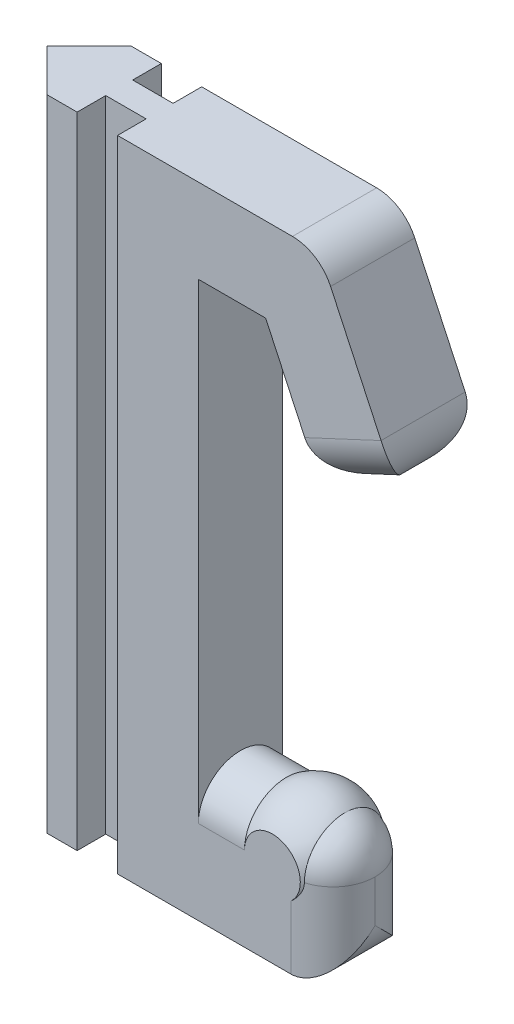
ISO-10303-21;
HEADER;
FILE_DESCRIPTION(('STEP AP214'),'2;1');
FILE_NAME('part.step','',(''),(''),'','','');
FILE_SCHEMA(('AUTOMOTIVE_DESIGN { 1 0 10303 214 1 1 1 1 }'));
ENDSEC;
DATA;
#1=APPLICATION_CONTEXT('core data for automotive mechanical design processes');
#2=APPLICATION_PROTOCOL_DEFINITION('international standard','automotive_design',2000,#1);
#3=PRODUCT_CONTEXT('',#1,'mechanical');
#4=PRODUCT('Part','Part','',(#3));
#5=PRODUCT_RELATED_PRODUCT_CATEGORY('part','',(#4));
#6=PRODUCT_DEFINITION_FORMATION('','',#4);
#7=PRODUCT_DEFINITION_CONTEXT('part definition',#1,'design');
#8=PRODUCT_DEFINITION('design','',#6,#7);
#9=PRODUCT_DEFINITION_SHAPE('','',#8);
#10=(LENGTH_UNIT() NAMED_UNIT(*) SI_UNIT(.MILLI.,.METRE.));
#11=(NAMED_UNIT(*) PLANE_ANGLE_UNIT() SI_UNIT($,.RADIAN.));
#12=(NAMED_UNIT(*) SI_UNIT($,.STERADIAN.) SOLID_ANGLE_UNIT());
#13=UNCERTAINTY_MEASURE_WITH_UNIT(LENGTH_MEASURE(1.E-05),#10,'distance_accuracy_value','');
#14=(GEOMETRIC_REPRESENTATION_CONTEXT(3) GLOBAL_UNCERTAINTY_ASSIGNED_CONTEXT((#13)) GLOBAL_UNIT_ASSIGNED_CONTEXT((#10,
#11,#12)) REPRESENTATION_CONTEXT('',''));
#15=CARTESIAN_POINT('',(0.,0.,0.));
#16=DIRECTION('',(0.,0.,1.));
#17=DIRECTION('',(1.,0.,0.));
#18=AXIS2_PLACEMENT_3D('',#15,#16,#17);
#19=CARTESIAN_POINT('',(13.5901699437495,0.,2.5));
#20=DIRECTION('',(-1.,0.,0.));
#21=DIRECTION('',(0.,0.,1.));
#22=AXIS2_PLACEMENT_3D('',#19,#20,#21);
#23=CYLINDRICAL_SURFACE('',#22,2.5);
#24=CARTESIAN_POINT('',(2.7416876048223,0.,2.5));
#25=DIRECTION('',(1.,0.,0.));
#26=DIRECTION('',(0.,0.,-1.));
#27=AXIS2_PLACEMENT_3D('',#24,#25,#26);
#28=CIRCLE('',#27,2.5);
#29=CARTESIAN_POINT('',(2.7416876048223,0.,0.));
#30=VERTEX_POINT('',#29);
#31=CARTESIAN_POINT('',(2.7416876048223,0.,5.));
#32=VERTEX_POINT('',#31);
#33=EDGE_CURVE('E319',#30,#32,#28,.T.);
#34=ORIENTED_EDGE('',*,*,#33,.F.);
#35=DIRECTION('',(-1.,0.,0.));
#36=VECTOR('',#35,1.);
#37=CARTESIAN_POINT('',(0.,0.,0.));
#38=LINE('',#37,#36);
#39=CARTESIAN_POINT('',(0.,0.,0.));
#40=VERTEX_POINT('',#39);
#41=EDGE_CURVE('E377',#30,#40,#38,.T.);
#42=ORIENTED_EDGE('',*,*,#41,.T.);
#43=CARTESIAN_POINT('',(0.,0.,2.5));
#44=DIRECTION('',(1.,0.,0.));
#45=DIRECTION('',(0.,0.,-1.));
#46=AXIS2_PLACEMENT_3D('',#43,#44,#45);
#47=CIRCLE('',#46,2.5);
#48=CARTESIAN_POINT('',(0.,0.,5.));
#49=VERTEX_POINT('',#48);
#50=EDGE_CURVE('E462',#40,#49,#47,.T.);
#51=ORIENTED_EDGE('',*,*,#50,.T.);
#52=DIRECTION('',(-1.,0.,0.));
#53=VECTOR('',#52,1.);
#54=CARTESIAN_POINT('',(0.,0.,5.));
#55=LINE('',#54,#53);
#56=EDGE_CURVE('E379',#32,#49,#55,.T.);
#57=ORIENTED_EDGE('',*,*,#56,.F.);
#58=EDGE_LOOP('',(#34,#42,#51,#57));
#59=FACE_BOUND('',#58,.T.);
#60=ADVANCED_FACE('F38',(#59),#23,.T.);
#61=CARTESIAN_POINT('',(5.5,0.,2.5));
#62=DIRECTION('',(0.,-1.,0.));
#63=DIRECTION('',(0.,0.,-1.));
#64=AXIS2_PLACEMENT_3D('',#61,#62,#63);
#65=CYLINDRICAL_SURFACE('',#64,2.5);
#66=DIRECTION('',(0.,1.,0.));
#67=VECTOR('',#66,1.);
#68=CARTESIAN_POINT('',(5.5,-5.,0.));
#69=LINE('',#68,#67);
#70=CARTESIAN_POINT('',(5.5,-1.24096736459909,0.));
#71=VERTEX_POINT('',#70);
#72=CARTESIAN_POINT('',(5.5,-5.,0.));
#73=VERTEX_POINT('',#72);
#74=EDGE_CURVE('E470',#71,#73,#69,.F.);
#75=ORIENTED_EDGE('',*,*,#74,.F.);
#76=CARTESIAN_POINT('',(5.4998,-1.24114463299005,8.00000016902827E-09));
#77=CARTESIAN_POINT('',(5.5363929673262,-1.2087029649529,-9.26164938594418E-06));
#78=CARTESIAN_POINT('',(5.57236876038989,-1.17555626849877,0.000797701220164483));
#79=CARTESIAN_POINT('',(5.6428030561148,-1.10769667819631,0.00383433659862335));
#80=CARTESIAN_POINT('',(5.67726031215857,-1.07298254322828,0.00606515556717435));
#81=CARTESIAN_POINT('',(5.74519128912905,-1.00095424317269,0.0118132669352874));
#82=CARTESIAN_POINT('',(5.77861573042543,-0.963595826296858,0.0153626740978221));
#83=CARTESIAN_POINT('',(5.84305795009588,-0.886981329738945,0.0234356736079336));
#84=CARTESIAN_POINT('',(5.8740762229525,-0.847725642663384,0.0279590650703916));
#85=CARTESIAN_POINT('',(5.96325201148396,-0.726269508254624,0.0425618511089545));
#86=CARTESIAN_POINT('',(6.01705538420124,-0.640865596374252,0.0536260746175861));
#87=CARTESIAN_POINT('',(6.10655009460944,-0.461922147892547,0.0742583939748457));
#88=CARTESIAN_POINT('',(6.14249859084772,-0.368522297372846,0.0838462716282923));
#89=CARTESIAN_POINT('',(6.17730370336194,-0.227795718404401,0.0934686773099394));
#90=CARTESIAN_POINT('',(6.18570287472368,-0.182960244601201,0.095864159554696));
#91=CARTESIAN_POINT('',(6.19710907659667,-0.0920455434275465,0.0991560697495526));
#92=CARTESIAN_POINT('',(6.20005395659277,-0.0459579806521384,0.100035211650277));
#93=CARTESIAN_POINT('',(6.19999998181818,0.000200000000000708,0.0999999946969699));
#94=B_SPLINE_CURVE_WITH_KNOTS('',3,(#76,#77,#78,#79,#80,#81,#82,#83,#84,#85,#86,#87,#88,#89,#90,
#91,#92,#93),.UNSPECIFIED.,.F.,.F.,(4,2,2,2,2,2,2,2,4),(0.,0.146701218214616,0.29352070649968,
0.444179394748281,0.594807039223552,0.898088830284033,1.196865790681,1.3335683412279,
1.4718192264105),.UNSPECIFIED.);
#95=CARTESIAN_POINT('',(6.2,0.,0.100000000000001));
#96=VERTEX_POINT('',#95);
#97=EDGE_CURVE('E310',#71,#96,#94,.T.);
#98=ORIENTED_EDGE('',*,*,#97,.T.);
#99=CARTESIAN_POINT('',(5.5,0.,2.5));
#100=DIRECTION('',(0.,1.,0.));
#101=DIRECTION('',(0.,0.,1.));
#102=AXIS2_PLACEMENT_3D('',#99,#100,#101);
#103=CIRCLE('',#102,2.5);
#104=CARTESIAN_POINT('',(8.,0.,2.5));
#105=VERTEX_POINT('',#104);
#106=EDGE_CURVE('E486',#105,#96,#103,.T.);
#107=ORIENTED_EDGE('',*,*,#106,.F.);
#108=DIRECTION('',(0.,1.,0.));
#109=VECTOR('',#108,1.);
#110=CARTESIAN_POINT('',(8.,0.,2.5));
#111=LINE('',#110,#109);
#112=CARTESIAN_POINT('',(8.,-2.5,2.5));
#113=VERTEX_POINT('',#112);
#114=EDGE_CURVE('E483',#113,#105,#111,.T.);
#115=ORIENTED_EDGE('',*,*,#114,.F.);
#116=CARTESIAN_POINT('',(5.5,-2.5,2.5));
#117=DIRECTION('',(0.,0.707106781186547,-0.707106781186547));
#118=DIRECTION('',(0.,-0.707106781186547,-0.707106781186547));
#119=AXIS2_PLACEMENT_3D('',#116,#117,#118);
#120=ELLIPSE('',#119,3.53553390593274,2.5);
#121=EDGE_CURVE('E344',#73,#113,#120,.F.);
#122=ORIENTED_EDGE('',*,*,#121,.F.);
#123=EDGE_LOOP('',(#75,#98,#107,#115,#122));
#124=FACE_BOUND('',#123,.T.);
#125=ADVANCED_FACE('F40',(#124),#65,.T.);
#126=CARTESIAN_POINT('',(5.5,0.,2.5));
#127=DIRECTION('',(-1.,0.,0.));
#128=DIRECTION('',(0.,0.,1.));
#129=AXIS2_PLACEMENT_3D('',#126,#127,#128);
#130=SPHERICAL_SURFACE('',#129,2.5);
#131=ORIENTED_EDGE('',*,*,#106,.T.);
#132=CARTESIAN_POINT('',(6.2,0.,2.5));
#133=DIRECTION('',(-1.,0.,0.));
#134=DIRECTION('',(0.,0.,1.));
#135=AXIS2_PLACEMENT_3D('',#132,#133,#134);
#136=CIRCLE('',#135,2.4);
#137=CARTESIAN_POINT('',(6.2,0.,4.9));
#138=VERTEX_POINT('',#137);
#139=EDGE_CURVE('E286',#96,#138,#136,.F.);
#140=ORIENTED_EDGE('',*,*,#139,.T.);
#141=CARTESIAN_POINT('',(5.5,0.,2.5));
#142=DIRECTION('',(0.,-1.,0.));
#143=DIRECTION('',(0.,0.,-1.));
#144=AXIS2_PLACEMENT_3D('',#141,#142,#143);
#145=CIRCLE('',#144,2.5);
#146=EDGE_CURVE('E382',#105,#138,#145,.T.);
#147=ORIENTED_EDGE('',*,*,#146,.F.);
#148=EDGE_LOOP('',(#131,#140,#147));
#149=FACE_BOUND('',#148,.T.);
#150=ADVANCED_FACE('F352',(#149),#130,.T.);
#151=CARTESIAN_POINT('',(5.5,0.,2.5));
#152=DIRECTION('',(0.,1.,0.));
#153=DIRECTION('',(0.,0.,1.));
#154=AXIS2_PLACEMENT_3D('',#151,#152,#153);
#155=CYLINDRICAL_SURFACE('',#154,2.5);
#156=ORIENTED_EDGE('',*,*,#146,.T.);
#157=CARTESIAN_POINT('',(6.19999998181818,0.0002,4.90000000530303));
#158=CARTESIAN_POINT('',(6.20002060593483,-0.0340215820751625,4.8999881731683));
#159=CARTESIAN_POINT('',(6.1984143593459,-0.0682209096207422,4.90046286433432));
#160=CARTESIAN_POINT('',(6.19208379810463,-0.136249463080852,4.90229830533756));
#161=CARTESIAN_POINT('',(6.18736474729119,-0.170079215952131,4.90365755930238));
#162=CARTESIAN_POINT('',(6.1689482938362,-0.269536910764676,4.90887369332737));
#163=CARTESIAN_POINT('',(6.15098131886339,-0.334336983187606,4.91387497360715));
#164=CARTESIAN_POINT('',(6.09808868579219,-0.480851170246759,4.92759913373652));
#165=CARTESIAN_POINT('',(6.05953499991633,-0.561148858343043,4.9370045157109));
#166=CARTESIAN_POINT('',(5.97007827325949,-0.715449277029459,4.95583685420229));
#167=CARTESIAN_POINT('',(5.91904380010561,-0.789372868652353,4.96526290588241));
#168=CARTESIAN_POINT('',(5.80922506209963,-0.929818254648964,4.98141526656959));
#169=CARTESIAN_POINT('',(5.75055545651682,-0.996426935956447,4.98817650123594));
#170=CARTESIAN_POINT('',(5.65870838300495,-1.09170672728009,4.99514321976577));
#171=CARTESIAN_POINT('',(5.62774086496115,-1.12244386881611,4.99693401300135));
#172=CARTESIAN_POINT('',(5.56461568283012,-1.1826876244331,4.99936451304459));
#173=CARTESIAN_POINT('',(5.5324586096933,-1.21219483443042,5.00000478377816));
#174=CARTESIAN_POINT('',(5.4998,-1.24114463299005,4.999999992));
#175=B_SPLINE_CURVE_WITH_KNOTS('',3,(#157,#158,#159,#160,#161,#162,#163,#164,#165,#166,#167,
#168,#169,#170,#171,#172,#173,#174),.UNSPECIFIED.,.F.,.F.,(4,2,2,2,2,2,2,2,4),(0.,
0.102583403755103,0.204993779301411,0.406260766109181,0.673486519863846,0.943657669752398,
1.21015973265302,1.34112701736425,1.47203009124063),.UNSPECIFIED.);
#176=CARTESIAN_POINT('',(5.5,-1.24096736459909,5.));
#177=VERTEX_POINT('',#176);
#178=EDGE_CURVE('E334',#138,#177,#175,.T.);
#179=ORIENTED_EDGE('',*,*,#178,.T.);
#180=DIRECTION('',(0.,1.,0.));
#181=VECTOR('',#180,1.);
#182=CARTESIAN_POINT('',(5.5,0.,5.));
#183=LINE('',#182,#181);
#184=CARTESIAN_POINT('',(5.5,-5.,5.));
#185=VERTEX_POINT('',#184);
#186=EDGE_CURVE('E456',#185,#177,#183,.T.);
#187=ORIENTED_EDGE('',*,*,#186,.F.);
#188=CARTESIAN_POINT('',(5.5,-2.5,2.5));
#189=DIRECTION('',(0.,-0.707106781186547,-0.707106781186547));
#190=DIRECTION('',(0.,0.707106781186547,-0.707106781186547));
#191=AXIS2_PLACEMENT_3D('',#188,#189,#190);
#192=ELLIPSE('',#191,3.53553390593274,2.5);
#193=EDGE_CURVE('E479',#185,#113,#192,.F.);
#194=ORIENTED_EDGE('',*,*,#193,.T.);
#195=ORIENTED_EDGE('',*,*,#114,.T.);
#196=EDGE_LOOP('',(#156,#179,#187,#194,#195));
#197=FACE_BOUND('',#196,.T.);
#198=ADVANCED_FACE('F346',(#197),#155,.T.);
#199=CARTESIAN_POINT('',(0.,0.,5.));
#200=DIRECTION('',(-1.,0.,0.));
#201=DIRECTION('',(0.,0.,1.));
#202=AXIS2_PLACEMENT_3D('',#199,#200,#201);
#203=PLANE('',#202);
#204=ORIENTED_EDGE('',*,*,#50,.F.);
#205=DIRECTION('',(0.,1.,0.));
#206=VECTOR('',#205,1.);
#207=CARTESIAN_POINT('',(0.,0.,0.));
#208=LINE('',#207,#206);
#209=CARTESIAN_POINT('',(0.,28.,0.));
#210=VERTEX_POINT('',#209);
#211=EDGE_CURVE('E389',#40,#210,#208,.T.);
#212=ORIENTED_EDGE('',*,*,#211,.T.);
#213=DIRECTION('',(0.,0.,-1.));
#214=VECTOR('',#213,1.);
#215=CARTESIAN_POINT('',(0.,28.,5.));
#216=LINE('',#215,#214);
#217=CARTESIAN_POINT('',(0.,28.,5.));
#218=VERTEX_POINT('',#217);
#219=EDGE_CURVE('E426',#218,#210,#216,.T.);
#220=ORIENTED_EDGE('',*,*,#219,.F.);
#221=DIRECTION('',(0.,1.,0.));
#222=VECTOR('',#221,1.);
#223=CARTESIAN_POINT('',(0.,0.,5.));
#224=LINE('',#223,#222);
#225=EDGE_CURVE('E498',#49,#218,#224,.T.);
#226=ORIENTED_EDGE('',*,*,#225,.F.);
#227=EDGE_LOOP('',(#204,#212,#220,#226));
#228=FACE_BOUND('',#227,.T.);
#229=ADVANCED_FACE('F351',(#228),#203,.F.);
#230=CARTESIAN_POINT('',(0.,28.,5.));
#231=DIRECTION('',(0.,1.,0.));
#232=DIRECTION('',(0.,0.,1.));
#233=AXIS2_PLACEMENT_3D('',#230,#231,#232);
#234=PLANE('',#233);
#235=DIRECTION('',(1.,0.,0.));
#236=VECTOR('',#235,1.);
#237=CARTESIAN_POINT('',(0.,28.,0.));
#238=LINE('',#237,#236);
#239=CARTESIAN_POINT('',(4.,28.,0.));
#240=VERTEX_POINT('',#239);
#241=EDGE_CURVE('E396',#210,#240,#238,.T.);
#242=ORIENTED_EDGE('',*,*,#241,.T.);
#243=DIRECTION('',(0.,0.,-1.));
#244=VECTOR('',#243,1.);
#245=CARTESIAN_POINT('',(4.,28.,5.));
#246=LINE('',#245,#244);
#247=CARTESIAN_POINT('',(4.,28.,5.));
#248=VERTEX_POINT('',#247);
#249=EDGE_CURVE('E422',#248,#240,#246,.T.);
#250=ORIENTED_EDGE('',*,*,#249,.F.);
#251=DIRECTION('',(1.,0.,0.));
#252=VECTOR('',#251,1.);
#253=CARTESIAN_POINT('',(0.,28.,5.));
#254=LINE('',#253,#252);
#255=EDGE_CURVE('E501',#218,#248,#254,.T.);
#256=ORIENTED_EDGE('',*,*,#255,.F.);
#257=ORIENTED_EDGE('',*,*,#219,.T.);
#258=EDGE_LOOP('',(#242,#250,#256,#257));
#259=FACE_BOUND('',#258,.T.);
#260=ADVANCED_FACE('F529',(#259),#234,.F.);
#261=CARTESIAN_POINT('',(4.,28.,5.));
#262=DIRECTION('',(0.906307787036651,0.422618261740697,0.));
#263=DIRECTION('',(-0.422618261740697,0.906307787036651,0.));
#264=AXIS2_PLACEMENT_3D('',#261,#262,#263);
#265=PLANE('',#264);
#266=DIRECTION('',(0.422618261740697,-0.906307787036651,0.));
#267=VECTOR('',#266,1.);
#268=CARTESIAN_POINT('',(4.,28.,0.));
#269=LINE('',#268,#267);
#270=CARTESIAN_POINT('',(6.32440043957384,23.0153071712984,0.));
#271=VERTEX_POINT('',#270);
#272=EDGE_CURVE('E407',#240,#271,#269,.T.);
#273=ORIENTED_EDGE('',*,*,#272,.T.);
#274=DIRECTION('',(0.,0.,-1.));
#275=VECTOR('',#274,1.);
#276=CARTESIAN_POINT('',(6.32440043957383,23.0153071712984,5.));
#277=LINE('',#276,#275);
#278=CARTESIAN_POINT('',(6.32440043957384,23.0153071712984,5.));
#279=VERTEX_POINT('',#278);
#280=EDGE_CURVE('E430',#271,#279,#277,.F.);
#281=ORIENTED_EDGE('',*,*,#280,.T.);
#282=DIRECTION('',(0.422618261740697,-0.906307787036651,0.));
#283=VECTOR('',#282,1.);
#284=CARTESIAN_POINT('',(4.,28.,5.));
#285=LINE('',#284,#283);
#286=EDGE_CURVE('E504',#248,#279,#285,.T.);
#287=ORIENTED_EDGE('',*,*,#286,.F.);
#288=ORIENTED_EDGE('',*,*,#249,.T.);
#289=EDGE_LOOP('',(#273,#281,#287,#288));
#290=FACE_BOUND('',#289,.T.);
#291=ADVANCED_FACE('F534',(#290),#265,.F.);
#292=CARTESIAN_POINT('',(11.9124850291088,22.8626290124103,5.));
#293=DIRECTION('',(-0.906307787036651,-0.422618261740697,0.));
#294=DIRECTION('',(0.422618261740697,-0.906307787036651,0.));
#295=AXIS2_PLACEMENT_3D('',#292,#293,#294);
#296=PLANE('',#295);
#297=DIRECTION('',(-0.422618261740697,0.906307787036651,0.));
#298=VECTOR('',#297,1.);
#299=CARTESIAN_POINT('',(11.9124850291088,22.8626290124103,5.));
#300=LINE('',#299,#298);
#301=CARTESIAN_POINT('',(10.8559393747571,25.1283984800019,5.));
#302=VERTEX_POINT('',#301);
#303=CARTESIAN_POINT('',(7.85844511961037,31.5565456543517,5.));
#304=VERTEX_POINT('',#303);
#305=EDGE_CURVE('E508',#302,#304,#300,.T.);
#306=ORIENTED_EDGE('',*,*,#305,.F.);
#307=DIRECTION('',(0.,0.,-1.));
#308=VECTOR('',#307,1.);
#309=CARTESIAN_POINT('',(10.8559393747571,25.1283984800019,5.));
#310=LINE('',#309,#308);
#311=CARTESIAN_POINT('',(10.8559393747571,25.1283984800019,0.));
#312=VERTEX_POINT('',#311);
#313=EDGE_CURVE('E443',#302,#312,#310,.T.);
#314=ORIENTED_EDGE('',*,*,#313,.T.);
#315=DIRECTION('',(-0.422618261740697,0.906307787036651,0.));
#316=VECTOR('',#315,1.);
#317=CARTESIAN_POINT('',(11.9124850291088,22.8626290124103,0.));
#318=LINE('',#317,#316);
#319=CARTESIAN_POINT('',(7.85844511961037,31.5565456543517,0.));
#320=VERTEX_POINT('',#319);
#321=EDGE_CURVE('E411',#312,#320,#318,.T.);
#322=ORIENTED_EDGE('',*,*,#321,.T.);
#323=DIRECTION('',(0.,0.,-1.));
#324=VECTOR('',#323,1.);
#325=CARTESIAN_POINT('',(7.85844511961037,31.5565456543517,5.));
#326=LINE('',#325,#324);
#327=EDGE_CURVE('E440',#320,#304,#326,.F.);
#328=ORIENTED_EDGE('',*,*,#327,.T.);
#329=EDGE_LOOP('',(#306,#314,#322,#328));
#330=FACE_BOUND('',#329,.T.);
#331=ADVANCED_FACE('F551',(#330),#296,.F.);
#332=CARTESIAN_POINT('',(-5.,33.,5.));
#333=DIRECTION('',(0.,-1.,0.));
#334=DIRECTION('',(0.,0.,-1.));
#335=AXIS2_PLACEMENT_3D('',#332,#333,#334);
#336=PLANE('',#335);
#337=DIRECTION('',(-1.,0.,0.));
#338=VECTOR('',#337,1.);
#339=CARTESIAN_POINT('',(-5.,33.,0.));
#340=LINE('',#339,#338);
#341=CARTESIAN_POINT('',(5.59267565201873,33.,0.));
#342=VERTEX_POINT('',#341);
#343=CARTESIAN_POINT('',(-4.79999999999999,33.,0.));
#344=VERTEX_POINT('',#343);
#345=EDGE_CURVE('E415',#342,#344,#340,.T.);
#346=ORIENTED_EDGE('',*,*,#345,.T.);
#347=DIRECTION('',(0.,0.,-1.));
#348=VECTOR('',#347,1.);
#349=CARTESIAN_POINT('',(-4.79999999999999,33.,0.));
#350=LINE('',#349,#348);
#351=CARTESIAN_POINT('',(-4.79999999999999,33.,1.7));
#352=VERTEX_POINT('',#351);
#353=EDGE_CURVE('E231',#352,#344,#350,.T.);
#354=ORIENTED_EDGE('',*,*,#353,.F.);
#355=DIRECTION('',(1.,0.,0.));
#356=VECTOR('',#355,1.);
#357=CARTESIAN_POINT('',(-4.79999999999999,33.,1.7));
#358=LINE('',#357,#356);
#359=CARTESIAN_POINT('',(-7.19999999999999,33.,1.7));
#360=VERTEX_POINT('',#359);
#361=EDGE_CURVE('E240',#360,#352,#358,.T.);
#362=ORIENTED_EDGE('',*,*,#361,.F.);
#363=DIRECTION('',(0.,0.,1.));
#364=VECTOR('',#363,1.);
#365=CARTESIAN_POINT('',(-7.19999999999999,33.,1.7));
#366=LINE('',#365,#364);
#367=CARTESIAN_POINT('',(-7.19999999999999,33.,0.));
#368=VERTEX_POINT('',#367);
#369=EDGE_CURVE('E200',#368,#360,#366,.T.);
#370=ORIENTED_EDGE('',*,*,#369,.F.);
#371=DIRECTION('',(-1.,0.,0.));
#372=VECTOR('',#371,1.);
#373=CARTESIAN_POINT('',(-6.99999999999999,33.,0.));
#374=LINE('',#373,#372);
#375=CARTESIAN_POINT('',(-9.,33.,0.));
#376=VERTEX_POINT('',#375);
#377=EDGE_CURVE('E283',#368,#376,#374,.T.);
#378=ORIENTED_EDGE('',*,*,#377,.T.);
#379=DIRECTION('',(-0.707106781186548,0.,0.707106781186547));
#380=VECTOR('',#379,1.);
#381=CARTESIAN_POINT('',(-11.5,33.,2.5));
#382=LINE('',#381,#380);
#383=CARTESIAN_POINT('',(-11.5,33.,2.5));
#384=VERTEX_POINT('',#383);
#385=EDGE_CURVE('E280',#376,#384,#382,.T.);
#386=ORIENTED_EDGE('',*,*,#385,.T.);
#387=DIRECTION('',(0.707106781186548,0.,0.707106781186547));
#388=VECTOR('',#387,1.);
#389=CARTESIAN_POINT('',(-8.99999999999999,33.,5.));
#390=LINE('',#389,#388);
#391=CARTESIAN_POINT('',(-9.,33.,5.));
#392=VERTEX_POINT('',#391);
#393=EDGE_CURVE('E276',#384,#392,#390,.T.);
#394=ORIENTED_EDGE('',*,*,#393,.T.);
#395=DIRECTION('',(1.,0.,0.));
#396=VECTOR('',#395,1.);
#397=CARTESIAN_POINT('',(-6.99999999999999,33.,5.));
#398=LINE('',#397,#396);
#399=CARTESIAN_POINT('',(-7.2,33.,5.));
#400=VERTEX_POINT('',#399);
#401=EDGE_CURVE('E272',#392,#400,#398,.T.);
#402=ORIENTED_EDGE('',*,*,#401,.T.);
#403=DIRECTION('',(0.,0.,1.));
#404=VECTOR('',#403,1.);
#405=CARTESIAN_POINT('',(-7.19999999999999,33.,3.3));
#406=LINE('',#405,#404);
#407=CARTESIAN_POINT('',(-7.19999999999999,33.,3.3));
#408=VERTEX_POINT('',#407);
#409=EDGE_CURVE('E63',#408,#400,#406,.T.);
#410=ORIENTED_EDGE('',*,*,#409,.F.);
#411=DIRECTION('',(-1.,0.,0.));
#412=VECTOR('',#411,1.);
#413=CARTESIAN_POINT('',(-4.79999999999999,33.,3.3));
#414=LINE('',#413,#412);
#415=CARTESIAN_POINT('',(-4.79999999999999,33.,3.3));
#416=VERTEX_POINT('',#415);
#417=EDGE_CURVE('E243',#416,#408,#414,.T.);
#418=ORIENTED_EDGE('',*,*,#417,.F.);
#419=DIRECTION('',(0.,0.,-1.));
#420=VECTOR('',#419,1.);
#421=CARTESIAN_POINT('',(-4.79999999999999,33.,5.));
#422=LINE('',#421,#420);
#423=CARTESIAN_POINT('',(-4.79999999999999,33.,5.));
#424=VERTEX_POINT('',#423);
#425=EDGE_CURVE('E216',#424,#416,#422,.T.);
#426=ORIENTED_EDGE('',*,*,#425,.F.);
#427=DIRECTION('',(-1.,0.,0.));
#428=VECTOR('',#427,1.);
#429=CARTESIAN_POINT('',(-5.,33.,5.));
#430=LINE('',#429,#428);
#431=CARTESIAN_POINT('',(5.59267565201873,33.,5.));
#432=VERTEX_POINT('',#431);
#433=EDGE_CURVE('E511',#432,#424,#430,.T.);
#434=ORIENTED_EDGE('',*,*,#433,.F.);
#435=DIRECTION('',(0.,0.,-1.));
#436=VECTOR('',#435,1.);
#437=CARTESIAN_POINT('',(5.59267565201874,33.,5.));
#438=LINE('',#437,#436);
#439=EDGE_CURVE('E452',#432,#342,#438,.T.);
#440=ORIENTED_EDGE('',*,*,#439,.T.);
#441=EDGE_LOOP('',(#346,#354,#362,#370,#378,#386,#394,#402,#410,#418,#426,#434,#440));
#442=FACE_BOUND('',#441,.T.);
#443=ADVANCED_FACE('F557',(#442),#336,.F.);
#444=CARTESIAN_POINT('',(8.,-5.,5.));
#445=DIRECTION('',(0.,1.,0.));
#446=DIRECTION('',(-1.,0.,0.));
#447=AXIS2_PLACEMENT_3D('',#444,#445,#446);
#448=PLANE('',#447);
#449=DIRECTION('',(-1.,0.,0.));
#450=VECTOR('',#449,1.);
#451=CARTESIAN_POINT('',(-4.8,-5.,1.7));
#452=LINE('',#451,#450);
#453=CARTESIAN_POINT('',(-4.8,-5.,1.7));
#454=VERTEX_POINT('',#453);
#455=CARTESIAN_POINT('',(-7.2,-5.,1.7));
#456=VERTEX_POINT('',#455);
#457=EDGE_CURVE('E208',#454,#456,#452,.T.);
#458=ORIENTED_EDGE('',*,*,#457,.F.);
#459=DIRECTION('',(0.,0.,1.));
#460=VECTOR('',#459,1.);
#461=CARTESIAN_POINT('',(-4.8,-5.,0.));
#462=LINE('',#461,#460);
#463=CARTESIAN_POINT('',(-4.8,-5.,0.));
#464=VERTEX_POINT('',#463);
#465=EDGE_CURVE('E205',#464,#454,#462,.T.);
#466=ORIENTED_EDGE('',*,*,#465,.F.);
#467=DIRECTION('',(1.,0.,0.));
#468=VECTOR('',#467,1.);
#469=CARTESIAN_POINT('',(8.,-5.,0.));
#470=LINE('',#469,#468);
#471=EDGE_CURVE('E419',#464,#73,#470,.T.);
#472=ORIENTED_EDGE('',*,*,#471,.T.);
#473=DIRECTION('',(0.,0.,-1.));
#474=VECTOR('',#473,1.);
#475=CARTESIAN_POINT('',(5.5,-5.,5.));
#476=LINE('',#475,#474);
#477=EDGE_CURVE('E343',#73,#185,#476,.F.);
#478=ORIENTED_EDGE('',*,*,#477,.T.);
#479=DIRECTION('',(1.,0.,0.));
#480=VECTOR('',#479,1.);
#481=CARTESIAN_POINT('',(8.,-5.,5.));
#482=LINE('',#481,#480);
#483=CARTESIAN_POINT('',(-4.8,-5.,5.));
#484=VERTEX_POINT('',#483);
#485=EDGE_CURVE('E402',#484,#185,#482,.T.);
#486=ORIENTED_EDGE('',*,*,#485,.F.);
#487=DIRECTION('',(0.,0.,1.));
#488=VECTOR('',#487,1.);
#489=CARTESIAN_POINT('',(-4.8,-5.,5.));
#490=LINE('',#489,#488);
#491=CARTESIAN_POINT('',(-4.8,-5.,3.3));
#492=VERTEX_POINT('',#491);
#493=EDGE_CURVE('E249',#492,#484,#490,.T.);
#494=ORIENTED_EDGE('',*,*,#493,.F.);
#495=DIRECTION('',(1.,0.,0.));
#496=VECTOR('',#495,1.);
#497=CARTESIAN_POINT('',(-4.8,-5.,3.3));
#498=LINE('',#497,#496);
#499=CARTESIAN_POINT('',(-7.2,-5.,3.3));
#500=VERTEX_POINT('',#499);
#501=EDGE_CURVE('E256',#500,#492,#498,.T.);
#502=ORIENTED_EDGE('',*,*,#501,.F.);
#503=DIRECTION('',(0.,0.,-1.));
#504=VECTOR('',#503,1.);
#505=CARTESIAN_POINT('',(-7.2,-5.,3.3));
#506=LINE('',#505,#504);
#507=CARTESIAN_POINT('',(-7.2,-5.,5.));
#508=VERTEX_POINT('',#507);
#509=EDGE_CURVE('E252',#508,#500,#506,.T.);
#510=ORIENTED_EDGE('',*,*,#509,.F.);
#511=DIRECTION('',(-1.,0.,0.));
#512=VECTOR('',#511,1.);
#513=CARTESIAN_POINT('',(-7.,-5.,5.));
#514=LINE('',#513,#512);
#515=CARTESIAN_POINT('',(-9.,-5.,5.));
#516=VERTEX_POINT('',#515);
#517=EDGE_CURVE('E239',#508,#516,#514,.T.);
#518=ORIENTED_EDGE('',*,*,#517,.T.);
#519=DIRECTION('',(-0.707106781186548,0.,-0.707106781186547));
#520=VECTOR('',#519,1.);
#521=CARTESIAN_POINT('',(-9.,-5.,5.));
#522=LINE('',#521,#520);
#523=CARTESIAN_POINT('',(-11.5,-5.,2.5));
#524=VERTEX_POINT('',#523);
#525=EDGE_CURVE('E289',#516,#524,#522,.T.);
#526=ORIENTED_EDGE('',*,*,#525,.T.);
#527=DIRECTION('',(0.707106781186548,0.,-0.707106781186547));
#528=VECTOR('',#527,1.);
#529=CARTESIAN_POINT('',(-11.5,-5.,2.5));
#530=LINE('',#529,#528);
#531=CARTESIAN_POINT('',(-9.,-5.,0.));
#532=VERTEX_POINT('',#531);
#533=EDGE_CURVE('E293',#524,#532,#530,.T.);
#534=ORIENTED_EDGE('',*,*,#533,.T.);
#535=DIRECTION('',(1.,0.,0.));
#536=VECTOR('',#535,1.);
#537=CARTESIAN_POINT('',(-7.,-5.,0.));
#538=LINE('',#537,#536);
#539=CARTESIAN_POINT('',(-7.2,-5.,0.));
#540=VERTEX_POINT('',#539);
#541=EDGE_CURVE('E222',#532,#540,#538,.T.);
#542=ORIENTED_EDGE('',*,*,#541,.T.);
#543=DIRECTION('',(0.,0.,-1.));
#544=VECTOR('',#543,1.);
#545=CARTESIAN_POINT('',(-7.2,-5.,1.7));
#546=LINE('',#545,#544);
#547=EDGE_CURVE('E55',#456,#540,#546,.T.);
#548=ORIENTED_EDGE('',*,*,#547,.F.);
#549=EDGE_LOOP('',(#458,#466,#472,#478,#486,#494,#502,#510,#518,#526,#534,#542,#548));
#550=FACE_BOUND('',#549,.T.);
#551=ADVANCED_FACE('F219',(#550),#448,.F.);
#552=CARTESIAN_POINT('',(0.,0.,5.));
#553=DIRECTION('',(0.,0.,-1.));
#554=DIRECTION('',(-1.,0.,0.));
#555=AXIS2_PLACEMENT_3D('',#552,#553,#554);
#556=PLANE('',#555);
#557=ORIENTED_EDGE('',*,*,#433,.T.);
#558=DIRECTION('',(0.,-1.,0.));
#559=VECTOR('',#558,1.);
#560=CARTESIAN_POINT('',(-4.79999999999999,35.9410882339705,5.));
#561=LINE('',#560,#559);
#562=EDGE_CURVE('E260',#424,#484,#561,.T.);
#563=ORIENTED_EDGE('',*,*,#562,.T.);
#564=ORIENTED_EDGE('',*,*,#485,.T.);
#565=ORIENTED_EDGE('',*,*,#186,.T.);
#566=CARTESIAN_POINT('',(4.4,0.,5.));
#567=DIRECTION('',(0.,0.,-1.));
#568=DIRECTION('',(-1.,0.,0.));
#569=AXIS2_PLACEMENT_3D('',#566,#567,#568);
#570=CIRCLE('',#569,1.6583123951777);
#571=EDGE_CURVE('E48',#32,#177,#570,.T.);
#572=ORIENTED_EDGE('',*,*,#571,.F.);
#573=ORIENTED_EDGE('',*,*,#56,.T.);
#574=ORIENTED_EDGE('',*,*,#225,.T.);
#575=ORIENTED_EDGE('',*,*,#255,.T.);
#576=ORIENTED_EDGE('',*,*,#286,.T.);
#577=DIRECTION('',(0.906307787036651,0.422618261740698,0.));
#578=VECTOR('',#577,1.);
#579=CARTESIAN_POINT('',(-7.68579698346491,16.4822448206721,5.));
#580=LINE('',#579,#578);
#581=EDGE_CURVE('E437',#279,#302,#580,.T.);
#582=ORIENTED_EDGE('',*,*,#581,.T.);
#583=ORIENTED_EDGE('',*,*,#305,.T.);
#584=CARTESIAN_POINT('',(5.59267565201874,30.5,5.));
#585=DIRECTION('',(0.,0.,-1.));
#586=DIRECTION('',(-1.,0.,0.));
#587=AXIS2_PLACEMENT_3D('',#584,#585,#586);
#588=CIRCLE('',#587,2.5);
#589=EDGE_CURVE('E434',#304,#432,#588,.F.);
#590=ORIENTED_EDGE('',*,*,#589,.T.);
#591=EDGE_LOOP('',(#557,#563,#564,#565,#572,#573,#574,#575,#576,#582,#583,#590));
#592=FACE_BOUND('',#591,.T.);
#593=ADVANCED_FACE('F518',(#592),#556,.F.);
#594=CARTESIAN_POINT('',(0.,0.,0.));
#595=DIRECTION('',(0.,0.,-1.));
#596=DIRECTION('',(-1.,0.,0.));
#597=AXIS2_PLACEMENT_3D('',#594,#595,#596);
#598=PLANE('',#597);
#599=DIRECTION('',(0.,-1.,0.));
#600=VECTOR('',#599,1.);
#601=CARTESIAN_POINT('',(-4.79999999999999,35.9410882339705,0.));
#602=LINE('',#601,#600);
#603=EDGE_CURVE('E232',#344,#464,#602,.T.);
#604=ORIENTED_EDGE('',*,*,#603,.F.);
#605=ORIENTED_EDGE('',*,*,#345,.F.);
#606=CARTESIAN_POINT('',(5.59267565201874,30.5,0.));
#607=DIRECTION('',(0.,0.,-1.));
#608=DIRECTION('',(-1.,0.,0.));
#609=AXIS2_PLACEMENT_3D('',#606,#607,#608);
#610=CIRCLE('',#609,2.5);
#611=EDGE_CURVE('E446',#342,#320,#610,.T.);
#612=ORIENTED_EDGE('',*,*,#611,.T.);
#613=ORIENTED_EDGE('',*,*,#321,.F.);
#614=DIRECTION('',(0.906307787036651,0.422618261740698,0.));
#615=VECTOR('',#614,1.);
#616=CARTESIAN_POINT('',(6.32440043957383,23.0153071712984,0.));
#617=LINE('',#616,#615);
#618=EDGE_CURVE('E449',#312,#271,#617,.F.);
#619=ORIENTED_EDGE('',*,*,#618,.T.);
#620=ORIENTED_EDGE('',*,*,#272,.F.);
#621=ORIENTED_EDGE('',*,*,#241,.F.);
#622=ORIENTED_EDGE('',*,*,#211,.F.);
#623=ORIENTED_EDGE('',*,*,#41,.F.);
#624=CARTESIAN_POINT('',(4.4,0.,0.));
#625=DIRECTION('',(0.,0.,1.));
#626=DIRECTION('',(1.,0.,0.));
#627=AXIS2_PLACEMENT_3D('',#624,#625,#626);
#628=CIRCLE('',#627,1.6583123951777);
#629=EDGE_CURVE('E11',#71,#30,#628,.T.);
#630=ORIENTED_EDGE('',*,*,#629,.F.);
#631=ORIENTED_EDGE('',*,*,#74,.T.);
#632=ORIENTED_EDGE('',*,*,#471,.F.);
#633=EDGE_LOOP('',(#604,#605,#612,#613,#619,#620,#621,#622,#623,#630,#631,#632));
#634=FACE_BOUND('',#633,.T.);
#635=ADVANCED_FACE('F385',(#634),#598,.T.);
#636=CARTESIAN_POINT('',(8.59016990716546,24.0718528256502,5.));
#637=DIRECTION('',(0.,0.,-1.));
#638=DIRECTION('',(-1.,0.,0.));
#639=AXIS2_PLACEMENT_3D('',#636,#637,#638);
#640=CYLINDRICAL_SURFACE('',#639,2.5);
#641=CARTESIAN_POINT('',(8.59016990716546,24.0718528256502,2.5));
#642=DIRECTION('',(-0.640856382055789,-0.298836238730119,-0.707106781186547));
#643=DIRECTION('',(-0.640856382055789,-0.298836238730119,0.707106781186547));
#644=AXIS2_PLACEMENT_3D('',#641,#642,#643);
#645=ELLIPSE('',#644,3.53553390593274,2.5);
#646=CARTESIAN_POINT('',(9.64671556151721,21.8060833580585,2.5));
#647=VERTEX_POINT('',#646);
#648=EDGE_CURVE('E399',#312,#647,#645,.T.);
#649=ORIENTED_EDGE('',*,*,#648,.F.);
#650=ORIENTED_EDGE('',*,*,#313,.F.);
#651=CARTESIAN_POINT('',(8.59016990716546,24.0718528256502,2.5));
#652=DIRECTION('',(0.640856382055789,0.298836238730119,-0.707106781186547));
#653=DIRECTION('',(-0.640856382055789,-0.298836238730119,-0.707106781186547));
#654=AXIS2_PLACEMENT_3D('',#651,#652,#653);
#655=ELLIPSE('',#654,3.53553390593274,2.5);
#656=EDGE_CURVE('E392',#647,#302,#655,.F.);
#657=ORIENTED_EDGE('',*,*,#656,.F.);
#658=EDGE_LOOP('',(#649,#650,#657));
#659=FACE_BOUND('',#658,.T.);
#660=ADVANCED_FACE('F548',(#659),#640,.T.);
#661=CARTESIAN_POINT('',(-7.68579698346491,16.4822448206721,2.5));
#662=DIRECTION('',(0.906307787036651,0.422618261740698,0.));
#663=DIRECTION('',(-0.422618261740698,0.906307787036651,0.));
#664=AXIS2_PLACEMENT_3D('',#661,#662,#663);
#665=CYLINDRICAL_SURFACE('',#664,2.5);
#666=ORIENTED_EDGE('',*,*,#656,.T.);
#667=ORIENTED_EDGE('',*,*,#581,.F.);
#668=CARTESIAN_POINT('',(8.59016990716546,24.0718528256502,2.5));
#669=DIRECTION('',(0.640856382055789,0.298836238730119,0.707106781186547));
#670=DIRECTION('',(0.640856382055789,0.298836238730119,-0.707106781186547));
#671=AXIS2_PLACEMENT_3D('',#668,#669,#670);
#672=ELLIPSE('',#671,3.53553390593274,2.5);
#673=EDGE_CURVE('E461',#647,#279,#672,.F.);
#674=ORIENTED_EDGE('',*,*,#673,.F.);
#675=EDGE_LOOP('',(#666,#667,#674));
#676=FACE_BOUND('',#675,.T.);
#677=ADVANCED_FACE('F547',(#676),#665,.T.);
#678=CARTESIAN_POINT('',(6.32440043957383,23.0153071712984,2.5));
#679=DIRECTION('',(-0.906307787036651,-0.422618261740698,0.));
#680=DIRECTION('',(0.422618261740698,-0.906307787036651,0.));
#681=AXIS2_PLACEMENT_3D('',#678,#679,#680);
#682=CYLINDRICAL_SURFACE('',#681,2.5);
#683=ORIENTED_EDGE('',*,*,#618,.F.);
#684=ORIENTED_EDGE('',*,*,#648,.T.);
#685=CARTESIAN_POINT('',(8.59016990716546,24.0718528256502,2.5));
#686=DIRECTION('',(-0.640856382055789,-0.298836238730119,0.707106781186547));
#687=DIRECTION('',(-0.640856382055789,-0.298836238730119,-0.707106781186547));
#688=AXIS2_PLACEMENT_3D('',#685,#686,#687);
#689=ELLIPSE('',#688,3.53553390593274,2.5);
#690=EDGE_CURVE('E457',#271,#647,#689,.T.);
#691=ORIENTED_EDGE('',*,*,#690,.F.);
#692=EDGE_LOOP('',(#683,#684,#691));
#693=FACE_BOUND('',#692,.T.);
#694=ADVANCED_FACE('F542',(#693),#682,.T.);
#695=CARTESIAN_POINT('',(8.59016990716546,24.0718528256502,5.));
#696=DIRECTION('',(0.,0.,-1.));
#697=DIRECTION('',(-1.,0.,0.));
#698=AXIS2_PLACEMENT_3D('',#695,#696,#697);
#699=CYLINDRICAL_SURFACE('',#698,2.5);
#700=ORIENTED_EDGE('',*,*,#673,.T.);
#701=ORIENTED_EDGE('',*,*,#280,.F.);
#702=ORIENTED_EDGE('',*,*,#690,.T.);
#703=EDGE_LOOP('',(#700,#701,#702));
#704=FACE_BOUND('',#703,.T.);
#705=ADVANCED_FACE('F363',(#704),#699,.T.);
#706=CARTESIAN_POINT('',(5.59267565201874,30.5,5.));
#707=DIRECTION('',(0.,0.,-1.));
#708=DIRECTION('',(-1.,0.,0.));
#709=AXIS2_PLACEMENT_3D('',#706,#707,#708);
#710=CYLINDRICAL_SURFACE('',#709,2.5);
#711=ORIENTED_EDGE('',*,*,#589,.F.);
#712=ORIENTED_EDGE('',*,*,#327,.F.);
#713=ORIENTED_EDGE('',*,*,#611,.F.);
#714=ORIENTED_EDGE('',*,*,#439,.F.);
#715=EDGE_LOOP('',(#711,#712,#713,#714));
#716=FACE_BOUND('',#715,.T.);
#717=ADVANCED_FACE('F354',(#716),#710,.T.);
#718=CARTESIAN_POINT('',(5.5,-2.5,5.));
#719=DIRECTION('',(0.,0.,-1.));
#720=DIRECTION('',(-1.,0.,0.));
#721=AXIS2_PLACEMENT_3D('',#718,#719,#720);
#722=CYLINDRICAL_SURFACE('',#721,2.5);
#723=ORIENTED_EDGE('',*,*,#477,.F.);
#724=ORIENTED_EDGE('',*,*,#121,.T.);
#725=ORIENTED_EDGE('',*,*,#193,.F.);
#726=EDGE_LOOP('',(#723,#724,#725));
#727=FACE_BOUND('',#726,.T.);
#728=ADVANCED_FACE('F327',(#727),#722,.T.);
#729=CARTESIAN_POINT('',(4.4,0.,2.5));
#730=DIRECTION('',(0.,0.,1.));
#731=DIRECTION('',(0.,1.,0.));
#732=AXIS2_PLACEMENT_3D('',#729,#730,#731);
#733=SPHERICAL_SURFACE('',#732,3.);
#734=ORIENTED_EDGE('',*,*,#97,.F.);
#735=ORIENTED_EDGE('',*,*,#629,.T.);
#736=ORIENTED_EDGE('',*,*,#33,.T.);
#737=ORIENTED_EDGE('',*,*,#571,.T.);
#738=ORIENTED_EDGE('',*,*,#178,.F.);
#739=ORIENTED_EDGE('',*,*,#139,.F.);
#740=EDGE_LOOP('',(#734,#735,#736,#737,#738,#739));
#741=FACE_BOUND('',#740,.T.);
#742=ADVANCED_FACE('F321',(#741),#733,.T.);
#743=CARTESIAN_POINT('',(-6.99999999999999,41.2006097334284,0.));
#744=DIRECTION('',(0.,0.,-1.));
#745=DIRECTION('',(-1.,0.,0.));
#746=AXIS2_PLACEMENT_3D('',#743,#744,#745);
#747=PLANE('',#746);
#748=DIRECTION('',(0.,-1.,0.));
#749=VECTOR('',#748,1.);
#750=CARTESIAN_POINT('',(-7.19999999999999,35.9410882339705,0.));
#751=LINE('',#750,#749);
#752=EDGE_CURVE('E204',#368,#540,#751,.T.);
#753=ORIENTED_EDGE('',*,*,#752,.T.);
#754=ORIENTED_EDGE('',*,*,#541,.F.);
#755=DIRECTION('',(0.,-1.,0.));
#756=VECTOR('',#755,1.);
#757=CARTESIAN_POINT('',(-8.99999999999999,41.2006097334284,0.));
#758=LINE('',#757,#756);
#759=EDGE_CURVE('E277',#376,#532,#758,.T.);
#760=ORIENTED_EDGE('',*,*,#759,.F.);
#761=ORIENTED_EDGE('',*,*,#377,.F.);
#762=EDGE_LOOP('',(#753,#754,#760,#761));
#763=FACE_BOUND('',#762,.T.);
#764=ADVANCED_FACE('F326',(#763),#747,.T.);
#765=CARTESIAN_POINT('',(-11.5,41.2006097334284,2.5));
#766=DIRECTION('',(-0.707106781186547,0.,-0.707106781186548));
#767=DIRECTION('',(-0.707106781186548,0.,0.707106781186547));
#768=AXIS2_PLACEMENT_3D('',#765,#766,#767);
#769=PLANE('',#768);
#770=ORIENTED_EDGE('',*,*,#385,.F.);
#771=ORIENTED_EDGE('',*,*,#759,.T.);
#772=ORIENTED_EDGE('',*,*,#533,.F.);
#773=DIRECTION('',(0.,-1.,0.));
#774=VECTOR('',#773,1.);
#775=CARTESIAN_POINT('',(-11.5,41.2006097334284,2.5));
#776=LINE('',#775,#774);
#777=EDGE_CURVE('E301',#384,#524,#776,.T.);
#778=ORIENTED_EDGE('',*,*,#777,.F.);
#779=EDGE_LOOP('',(#770,#771,#772,#778));
#780=FACE_BOUND('',#779,.T.);
#781=ADVANCED_FACE('F580',(#780),#769,.T.);
#782=CARTESIAN_POINT('',(-8.99999999999999,41.2006097334284,5.));
#783=DIRECTION('',(-0.707106781186547,0.,0.707106781186548));
#784=DIRECTION('',(0.707106781186548,0.,0.707106781186547));
#785=AXIS2_PLACEMENT_3D('',#782,#783,#784);
#786=PLANE('',#785);
#787=ORIENTED_EDGE('',*,*,#393,.F.);
#788=ORIENTED_EDGE('',*,*,#777,.T.);
#789=ORIENTED_EDGE('',*,*,#525,.F.);
#790=DIRECTION('',(0.,-1.,0.));
#791=VECTOR('',#790,1.);
#792=CARTESIAN_POINT('',(-8.99999999999999,41.2006097334284,5.));
#793=LINE('',#792,#791);
#794=EDGE_CURVE('E298',#392,#516,#793,.T.);
#795=ORIENTED_EDGE('',*,*,#794,.F.);
#796=EDGE_LOOP('',(#787,#788,#789,#795));
#797=FACE_BOUND('',#796,.T.);
#798=ADVANCED_FACE('F575',(#797),#786,.T.);
#799=CARTESIAN_POINT('',(-6.99999999999999,41.2006097334284,5.));
#800=DIRECTION('',(0.,0.,1.));
#801=DIRECTION('',(1.,0.,0.));
#802=AXIS2_PLACEMENT_3D('',#799,#800,#801);
#803=PLANE('',#802);
#804=DIRECTION('',(0.,-1.,0.));
#805=VECTOR('',#804,1.);
#806=CARTESIAN_POINT('',(-7.19999999999999,35.9410882339705,5.));
#807=LINE('',#806,#805);
#808=EDGE_CURVE('E266',#400,#508,#807,.T.);
#809=ORIENTED_EDGE('',*,*,#808,.F.);
#810=ORIENTED_EDGE('',*,*,#401,.F.);
#811=ORIENTED_EDGE('',*,*,#794,.T.);
#812=ORIENTED_EDGE('',*,*,#517,.F.);
#813=EDGE_LOOP('',(#809,#810,#811,#812));
#814=FACE_BOUND('',#813,.T.);
#815=ADVANCED_FACE('F329',(#814),#803,.T.);
#816=CARTESIAN_POINT('',(-4.79999999999999,35.9410882339705,5.));
#817=DIRECTION('',(1.,0.,0.));
#818=DIRECTION('',(0.,1.,0.));
#819=AXIS2_PLACEMENT_3D('',#816,#817,#818);
#820=PLANE('',#819);
#821=ORIENTED_EDGE('',*,*,#425,.T.);
#822=DIRECTION('',(0.,-1.,0.));
#823=VECTOR('',#822,1.);
#824=CARTESIAN_POINT('',(-4.79999999999999,35.9410882339705,3.3));
#825=LINE('',#824,#823);
#826=EDGE_CURVE('E244',#416,#492,#825,.T.);
#827=ORIENTED_EDGE('',*,*,#826,.T.);
#828=ORIENTED_EDGE('',*,*,#493,.T.);
#829=ORIENTED_EDGE('',*,*,#562,.F.);
#830=EDGE_LOOP('',(#821,#827,#828,#829));
#831=FACE_BOUND('',#830,.T.);
#832=ADVANCED_FACE('F563',(#831),#820,.F.);
#833=CARTESIAN_POINT('',(-4.79999999999999,35.9410882339705,3.3));
#834=DIRECTION('',(0.,0.,-1.));
#835=DIRECTION('',(-1.,0.,0.));
#836=AXIS2_PLACEMENT_3D('',#833,#834,#835);
#837=PLANE('',#836);
#838=ORIENTED_EDGE('',*,*,#417,.T.);
#839=DIRECTION('',(0.,-1.,0.));
#840=VECTOR('',#839,1.);
#841=CARTESIAN_POINT('',(-7.19999999999999,35.9410882339705,3.3));
#842=LINE('',#841,#840);
#843=EDGE_CURVE('E263',#408,#500,#842,.T.);
#844=ORIENTED_EDGE('',*,*,#843,.T.);
#845=ORIENTED_EDGE('',*,*,#501,.T.);
#846=ORIENTED_EDGE('',*,*,#826,.F.);
#847=EDGE_LOOP('',(#838,#844,#845,#846));
#848=FACE_BOUND('',#847,.T.);
#849=ADVANCED_FACE('F565',(#848),#837,.F.);
#850=CARTESIAN_POINT('',(-7.19999999999999,35.9410882339705,3.3));
#851=DIRECTION('',(-1.,0.,0.));
#852=DIRECTION('',(0.,-1.,0.));
#853=AXIS2_PLACEMENT_3D('',#850,#851,#852);
#854=PLANE('',#853);
#855=ORIENTED_EDGE('',*,*,#409,.T.);
#856=ORIENTED_EDGE('',*,*,#808,.T.);
#857=ORIENTED_EDGE('',*,*,#509,.T.);
#858=ORIENTED_EDGE('',*,*,#843,.F.);
#859=EDGE_LOOP('',(#855,#856,#857,#858));
#860=FACE_BOUND('',#859,.T.);
#861=ADVANCED_FACE('F597',(#860),#854,.F.);
#862=CARTESIAN_POINT('',(-4.79999999999999,35.9410882339705,1.7));
#863=DIRECTION('',(0.,0.,1.));
#864=DIRECTION('',(1.,0.,0.));
#865=AXIS2_PLACEMENT_3D('',#862,#863,#864);
#866=PLANE('',#865);
#867=ORIENTED_EDGE('',*,*,#361,.T.);
#868=DIRECTION('',(0.,-1.,0.));
#869=VECTOR('',#868,1.);
#870=CARTESIAN_POINT('',(-4.79999999999999,35.9410882339705,1.7));
#871=LINE('',#870,#869);
#872=EDGE_CURVE('E211',#352,#454,#871,.T.);
#873=ORIENTED_EDGE('',*,*,#872,.T.);
#874=ORIENTED_EDGE('',*,*,#457,.T.);
#875=DIRECTION('',(0.,-1.,0.));
#876=VECTOR('',#875,1.);
#877=CARTESIAN_POINT('',(-7.19999999999999,35.9410882339705,1.7));
#878=LINE('',#877,#876);
#879=EDGE_CURVE('E196',#360,#456,#878,.T.);
#880=ORIENTED_EDGE('',*,*,#879,.F.);
#881=EDGE_LOOP('',(#867,#873,#874,#880));
#882=FACE_BOUND('',#881,.T.);
#883=ADVANCED_FACE('F209',(#882),#866,.F.);
#884=CARTESIAN_POINT('',(-4.79999999999999,35.9410882339705,0.));
#885=DIRECTION('',(1.,0.,0.));
#886=DIRECTION('',(0.,1.,0.));
#887=AXIS2_PLACEMENT_3D('',#884,#885,#886);
#888=PLANE('',#887);
#889=ORIENTED_EDGE('',*,*,#353,.T.);
#890=ORIENTED_EDGE('',*,*,#603,.T.);
#891=ORIENTED_EDGE('',*,*,#465,.T.);
#892=ORIENTED_EDGE('',*,*,#872,.F.);
#893=EDGE_LOOP('',(#889,#890,#891,#892));
#894=FACE_BOUND('',#893,.T.);
#895=ADVANCED_FACE('F588',(#894),#888,.F.);
#896=CARTESIAN_POINT('',(-7.19999999999999,35.9410882339705,1.7));
#897=DIRECTION('',(-1.,0.,0.));
#898=DIRECTION('',(0.,-1.,0.));
#899=AXIS2_PLACEMENT_3D('',#896,#897,#898);
#900=PLANE('',#899);
#901=ORIENTED_EDGE('',*,*,#369,.T.);
#902=ORIENTED_EDGE('',*,*,#879,.T.);
#903=ORIENTED_EDGE('',*,*,#547,.T.);
#904=ORIENTED_EDGE('',*,*,#752,.F.);
#905=EDGE_LOOP('',(#901,#902,#903,#904));
#906=FACE_BOUND('',#905,.T.);
#907=ADVANCED_FACE('F198',(#906),#900,.F.);
#908=CLOSED_SHELL('',(#60,#125,#150,#198,#229,#260,#291,#331,#443,#551,#593,#635,#660,#677,#694,
#705,#717,#728,#742,#764,#781,#798,#815,#832,#849,#861,#883,#895,#907));
#909=MANIFOLD_SOLID_BREP('B2',#908);
#910=ADVANCED_BREP_SHAPE_REPRESENTATION('',(#18,#909),#14);
#911=SHAPE_DEFINITION_REPRESENTATION(#9,#910);
ENDSEC;
END-ISO-10303-21;
